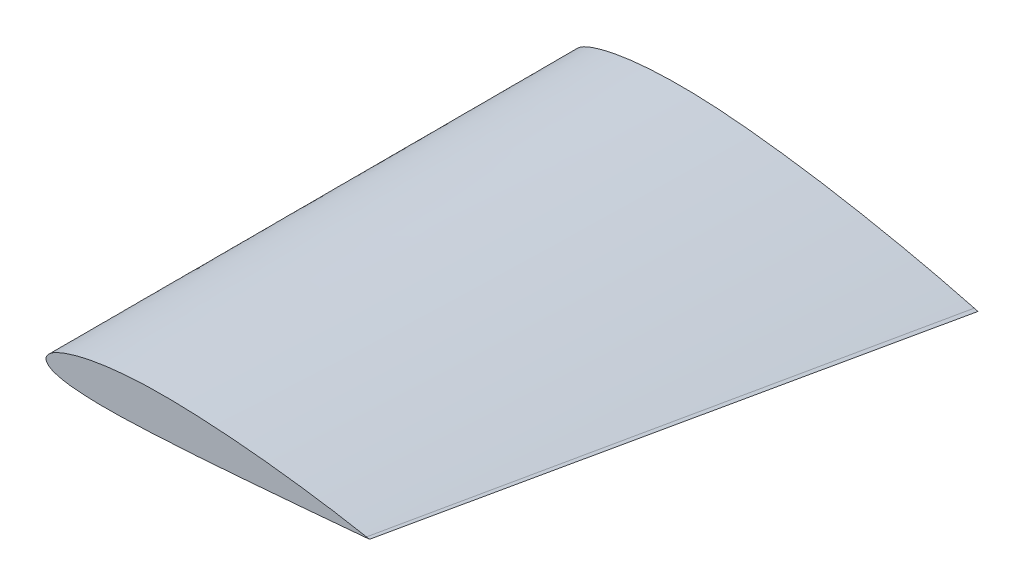
ISO-10303-21;
HEADER;
FILE_DESCRIPTION(('STEP AP214'),'2;1');
FILE_NAME('part.step','',(''),(''),'','','');
FILE_SCHEMA(('AUTOMOTIVE_DESIGN { 1 0 10303 214 1 1 1 1 }'));
ENDSEC;
DATA;
#1=APPLICATION_CONTEXT('core data for automotive mechanical design processes');
#2=APPLICATION_PROTOCOL_DEFINITION('international standard','automotive_design',2000,#1);
#3=PRODUCT_CONTEXT('',#1,'mechanical');
#4=PRODUCT('Part','Part','',(#3));
#5=PRODUCT_RELATED_PRODUCT_CATEGORY('part','',(#4));
#6=PRODUCT_DEFINITION_FORMATION('','',#4);
#7=PRODUCT_DEFINITION_CONTEXT('part definition',#1,'design');
#8=PRODUCT_DEFINITION('design','',#6,#7);
#9=PRODUCT_DEFINITION_SHAPE('','',#8);
#10=(LENGTH_UNIT() NAMED_UNIT(*) SI_UNIT(.MILLI.,.METRE.));
#11=(NAMED_UNIT(*) PLANE_ANGLE_UNIT() SI_UNIT($,.RADIAN.));
#12=(NAMED_UNIT(*) SI_UNIT($,.STERADIAN.) SOLID_ANGLE_UNIT());
#13=UNCERTAINTY_MEASURE_WITH_UNIT(LENGTH_MEASURE(1.E-05),#10,'distance_accuracy_value','');
#14=(GEOMETRIC_REPRESENTATION_CONTEXT(3) GLOBAL_UNCERTAINTY_ASSIGNED_CONTEXT((#13)) GLOBAL_UNIT_ASSIGNED_CONTEXT((#10,
#11,#12)) REPRESENTATION_CONTEXT('',''));
#15=CARTESIAN_POINT('',(0.,0.,0.));
#16=DIRECTION('',(0.,0.,1.));
#17=DIRECTION('',(1.,0.,0.));
#18=AXIS2_PLACEMENT_3D('',#15,#16,#17);
#19=CARTESIAN_POINT('',(25.2194378154388,32.3260001275835,762.));
#20=DIRECTION('',(0.,0.,-1.));
#21=DIRECTION('',(-1.,0.,0.));
#22=AXIS2_PLACEMENT_3D('',#19,#20,#21);
#23=PLANE('',#22);
#24=CARTESIAN_POINT('',(268.796840466726,35.6688979538992,762.));
#25=CARTESIAN_POINT('',(264.720288829095,36.42384319273,762.));
#26=CARTESIAN_POINT('',(256.577892295825,37.9317508661474,762.));
#27=CARTESIAN_POINT('',(240.284487090343,40.6674807716953,762.));
#28=CARTESIAN_POINT('',(219.915007865058,43.6546594969312,762.));
#29=CARTESIAN_POINT('',(195.466083589583,46.6823417151449,762.));
#30=CARTESIAN_POINT('',(171.032194679107,49.1304713415767,762.));
#31=CARTESIAN_POINT('',(146.602549734739,50.7987882256745,762.));
#32=CARTESIAN_POINT('',(122.191533804464,51.7790832284373,762.));
#33=CARTESIAN_POINT('',(101.842925906633,51.6368951043081,762.));
#34=CARTESIAN_POINT('',(85.5965779619275,50.6548527830006,762.));
#35=CARTESIAN_POINT('',(73.4109942150773,49.4366631413632,762.));
#36=CARTESIAN_POINT('',(61.2209387887355,47.64260979663,762.));
#37=CARTESIAN_POINT('',(51.0876277171548,45.5260525553582,762.));
#38=CARTESIAN_POINT('',(43.0213639172621,43.1960430257897,762.));
#39=CARTESIAN_POINT('',(36.9122400554525,41.1009820798503,762.));
#40=CARTESIAN_POINT('',(31.7482460051694,38.6970494096198,762.));
#41=CARTESIAN_POINT('',(27.3091511377606,35.8171597516757,762.));
#42=CARTESIAN_POINT('',(23.4836316371999,30.9099748850938,762.));
#43=CARTESIAN_POINT('',(27.6334209430317,26.7393864897038,762.));
#44=CARTESIAN_POINT('',(32.0784001117748,24.8857129238249,762.));
#45=CARTESIAN_POINT('',(37.2912412060836,23.5125439264132,762.));
#46=CARTESIAN_POINT('',(43.4377659033016,22.5737484441929,762.));
#47=CARTESIAN_POINT('',(51.5949322119316,21.8279166124004,762.));
#48=CARTESIAN_POINT('',(61.7688680642337,21.3278754406256,762.));
#49=CARTESIAN_POINT('',(73.9746097226709,21.2818058683328,762.));
#50=CARTESIAN_POINT('',(86.1656281806745,21.5521795784776,762.));
#51=CARTESIAN_POINT('',(102.412296423288,22.2197741730752,762.));
#52=CARTESIAN_POINT('',(122.718782884065,23.2514268935811,762.));
#53=CARTESIAN_POINT('',(147.07692435792,24.838164982038,762.));
#54=CARTESIAN_POINT('',(171.421597620584,26.7615442253587,762.));
#55=CARTESIAN_POINT('',(195.769310914876,28.7425665906143,762.));
#56=CARTESIAN_POINT('',(220.120839870705,30.7422102052366,762.));
#57=CARTESIAN_POINT('',(240.40453676189,32.5431369772263,762.));
#58=CARTESIAN_POINT('',(256.637275317102,33.9433885459444,762.));
#59=CARTESIAN_POINT('',(264.751495034581,34.6711600343488,762.));
#60=CARTESIAN_POINT('',(268.808883507143,35.0350707676691,762.));
#61=B_SPLINE_CURVE_WITH_KNOTS('',3,(#24,#25,#26,#27,#28,#29,#30,#31,#32,#33,#34,#35,#36,#37,#38,
#39,#40,#41,#42,#43,#44,#45,#46,#47,#48,#49,#50,#51,#52,#53,#54,#55,#56,#57,#58,#59,#60),
.UNSPECIFIED.,.F.,.F.,(4,1,1,1,1,1,1,1,1,1,1,1,1,1,1,1,1,1,1,1,1,1,1,1,1,1,1,1,1,1,1,1,1,1,4),
(0.,0.0250124897498648,0.0499592861642578,0.0996729249269686,0.149206319909966,
0.198581096615965,0.247805170456833,0.296916574601493,0.345952721793533,0.370491625569911,
0.395091203654929,0.41981479582396,0.444798575016595,0.457489818915221,0.47040640543549,
0.483879408669829,0.491264120322896,0.503458853294665,0.513609129403887,0.520450990700287,
0.533235387615153,0.545691039147803,0.558031884237173,0.582609167247894,0.607134741746914,
0.631652079836766,0.656174271859652,0.705233949250519,0.754320378530032,0.803437363555032,
0.852566095729537,0.901700994033254,0.95084880933727,0.975422716989278,1.),.UNSPECIFIED.);
#62=CARTESIAN_POINT('',(268.796840466726,35.6688979538992,762.));
#63=VERTEX_POINT('',#62);
#64=CARTESIAN_POINT('',(268.808883507141,35.0350707676689,762.));
#65=VERTEX_POINT('',#64);
#66=EDGE_CURVE('E668',#63,#65,#61,.T.);
#67=ORIENTED_EDGE('',*,*,#66,.T.);
#68=DIRECTION('',(0.996001879144799,0.0893322827427458,0.));
#69=VECTOR('',#68,1.);
#70=CARTESIAN_POINT('',(268.808883507143,35.0350707676691,762.));
#71=LINE('',#70,#69);
#72=CARTESIAN_POINT('',(271.106577129521,35.2411529253721,762.));
#73=VERTEX_POINT('',#72);
#74=EDGE_CURVE('E678',#65,#73,#71,.T.);
#75=ORIENTED_EDGE('',*,*,#74,.T.);
#76=DIRECTION('',(-0.983280784130301,0.182095852671336,0.));
#77=VECTOR('',#76,1.);
#78=CARTESIAN_POINT('',(271.106577129521,35.2411529253721,762.));
#79=LINE('',#78,#77);
#80=EDGE_CURVE('E484',#73,#63,#79,.T.);
#81=ORIENTED_EDGE('',*,*,#80,.T.);
#82=EDGE_LOOP('',(#67,#75,#81));
#83=FACE_BOUND('',#82,.T.);
#84=ADVANCED_FACE('F461',(#83),#23,.F.);
#85=CARTESIAN_POINT('',(304.402760330862,-9.20630944659419,335.28));
#86=CARTESIAN_POINT('',(268.796840466726,35.6688979538992,762.));
#87=CARTESIAN_POINT('',(301.266510761918,-8.39271064769866,335.28));
#88=CARTESIAN_POINT('',(266.248166645337,36.1408922613008,762.));
#89=CARTESIAN_POINT('',(294.994284138828,-6.76444409501858,335.280000000001));
#90=CARTESIAN_POINT('',(261.150965673747,37.085682579858,762.));
#91=CARTESIAN_POINT('',(285.568661220944,-4.38921575994503,335.28));
#92=CARTESIAN_POINT('',(253.495217184841,38.4485713556741,762.));
#93=CARTESIAN_POINT('',(276.117955357118,-2.1157147127732,335.280000000001));
#94=CARTESIAN_POINT('',(245.825143919969,39.7285367861179,762.));
#95=CARTESIAN_POINT('',(266.648217750481,0.0768159385032686,335.279999999999));
#96=CARTESIAN_POINT('',(238.144494246198,40.9430045244643,762.));
#97=CARTESIAN_POINT('',(257.160348537304,2.18967346189355,335.280000000001));
#98=CARTESIAN_POINT('',(230.453865923155,42.0927994836091,762.));
#99=CARTESIAN_POINT('',(247.656518761221,4.22934208634511,335.28));
#100=CARTESIAN_POINT('',(222.754645788427,43.1833326368151,762.));
#101=CARTESIAN_POINT('',(238.138158778443,6.20013522855942,335.28));
#102=CARTESIAN_POINT('',(215.04771699275,44.2180538076119,762.));
#103=CARTESIAN_POINT('',(228.606164471254,8.10386014301631,335.28));
#104=CARTESIAN_POINT('',(207.333701022426,45.1984928912423,762.));
#105=CARTESIAN_POINT('',(219.060535904495,9.93802983943843,335.28));
#106=CARTESIAN_POINT('',(199.612736668103,46.1226619858701,761.999999999999));
#107=CARTESIAN_POINT('',(209.501882043381,11.7030672087625,335.28));
#108=CARTESIAN_POINT('',(191.885284394497,46.990919415791,762.000000000001));
#109=CARTESIAN_POINT('',(199.92985311861,13.3941380579975,335.28));
#110=CARTESIAN_POINT('',(184.151340549877,47.7994103361665,762.));
#111=CARTESIAN_POINT('',(190.343617483244,15.0028747008962,335.28));
#112=CARTESIAN_POINT('',(176.410711042312,48.541372278302,761.999999999999));
#113=CARTESIAN_POINT('',(180.742470752196,16.5201692299163,335.28));
#114=CARTESIAN_POINT('',(168.66335428455,49.2095654316961,762.));
#115=CARTESIAN_POINT('',(171.126579600997,17.941068761341,335.280000000001));
#116=CARTESIAN_POINT('',(160.909674094045,49.7999449615389,762.));
#117=CARTESIAN_POINT('',(161.497546721608,19.2698647981406,335.279999999999));
#118=CARTESIAN_POINT('',(153.150717839381,50.3161440514188,761.999999999999));
#119=CARTESIAN_POINT('',(151.856741940817,20.510306585202,335.280000000001));
#120=CARTESIAN_POINT('',(145.387355340324,50.7610985045953,762.000000000001));
#121=CARTESIAN_POINT('',(142.205054122065,21.6631790027971,335.279999999999));
#122=CARTESIAN_POINT('',(137.620262465177,51.1356382971318,761.999999999999));
#123=CARTESIAN_POINT('',(132.540979503285,22.7077687846836,335.280000000001));
#124=CARTESIAN_POINT('',(129.849399939509,51.4230279192925,762.000000000001));
#125=CARTESIAN_POINT('',(122.864020673809,23.625900180708,335.28));
#126=CARTESIAN_POINT('',(122.075408000748,51.6087745330922,762.));
#127=CARTESIAN_POINT('',(113.174250358081,24.3982191403113,335.28));
#128=CARTESIAN_POINT('',(114.299428209989,51.6774637539405,762.));
#129=CARTESIAN_POINT('',(105.089337160493,24.9006258286772,335.28));
#130=CARTESIAN_POINT('',(107.819369051546,51.6214278179531,762.));
#131=CARTESIAN_POINT('',(98.6163061153764,25.2057432680527,335.280000000001));
#132=CARTESIAN_POINT('',(102.636711639163,51.4991099979829,762.));
#133=CARTESIAN_POINT('',(93.7593890664864,25.3832476901494,335.279999999999));
#134=CARTESIAN_POINT('',(98.7509218765997,51.3662290319908,762.));
#135=CARTESIAN_POINT('',(88.9007721641182,25.5062344054871,335.28));
#136=CARTESIAN_POINT('',(94.8668437503008,51.1898073995601,761.999999999999));
#137=CARTESIAN_POINT('',(84.0410508960298,25.5727107153145,335.28));
#138=CARTESIAN_POINT('',(90.9850887515657,50.9681841523507,762.000000000001));
#139=CARTESIAN_POINT('',(79.1808762191103,25.5808897251505,335.28));
#140=CARTESIAN_POINT('',(87.1062585985881,50.7000470401854,762.));
#141=CARTESIAN_POINT('',(74.3209630105933,25.5291524352373,335.280000000001));
#142=CARTESIAN_POINT('',(83.2310278091211,50.384090425195,762.));
#143=CARTESIAN_POINT('',(69.4621117739859,25.4147172935621,335.28));
#144=CARTESIAN_POINT('',(79.3601853949637,50.018174463226,762.));
#145=CARTESIAN_POINT('',(64.6052628297273,25.2339003320378,335.280000000001));
#146=CARTESIAN_POINT('',(75.4946938947888,49.5993913886727,762.));
#147=CARTESIAN_POINT('',(59.7514957097872,24.9835066109058,335.28));
#148=CARTESIAN_POINT('',(71.6355928530709,49.1252679682732,762.));
#149=CARTESIAN_POINT('',(54.9020806484466,24.6591411180087,335.280000000001));
#150=CARTESIAN_POINT('',(67.784146173157,48.5923538822817,762.));
#151=CARTESIAN_POINT('',(50.0587506813058,24.2536656616004,335.28));
#152=CARTESIAN_POINT('',(63.9421383686307,47.9950699334941,762.));
#153=CARTESIAN_POINT('',(45.2233445387788,23.7623974286445,335.28));
#154=CARTESIAN_POINT('',(60.111302609857,47.3297635534051,762.));
#155=CARTESIAN_POINT('',(40.3985359966686,23.1754979793704,335.28));
#156=CARTESIAN_POINT('',(56.294330422911,46.5887080363908,761.999999999999));
#157=CARTESIAN_POINT('',(35.5890346152847,22.4732204650149,335.28));
#158=CARTESIAN_POINT('',(52.4960754079543,45.7565723844311,762.000000000001));
#159=CARTESIAN_POINT('',(31.5988198962123,21.7768696073491,335.28));
#160=CARTESIAN_POINT('',(49.3513053025004,44.9752562167625,761.999999999999));
#161=CARTESIAN_POINT('',(28.4209529521505,21.1444657553848,335.28));
#162=CARTESIAN_POINT('',(46.8511132508757,44.2911717924988,762.));
#163=CARTESIAN_POINT('',(26.0450780713698,20.6339376105932,335.28));
#164=CARTESIAN_POINT('',(44.9840809484571,43.7493073074737,762.));
#165=CARTESIAN_POINT('',(23.6772631714486,20.0871952646532,335.28));
#166=CARTESIAN_POINT('',(43.1254601022694,43.179356233858,761.999999999999));
#167=CARTESIAN_POINT('',(21.317876790477,19.5051299766339,335.28));
#168=CARTESIAN_POINT('',(41.27561120829,42.5814323123559,762.000000000001));
#169=CARTESIAN_POINT('',(18.9705130868035,18.8759922318505,335.28));
#170=CARTESIAN_POINT('',(39.4379860092005,41.9467803720737,761.999999999999));
#171=CARTESIAN_POINT('',(16.6395764126751,18.1882936804535,335.280000000001));
#172=CARTESIAN_POINT('',(37.6167983093212,41.2662402476059,762.000000000001));
#173=CARTESIAN_POINT('',(14.3298819819967,17.4319931748299,335.28));
#174=CARTESIAN_POINT('',(35.8164165855504,40.5322102004173,761.999999999999));
#175=CARTESIAN_POINT('',(12.0473799733319,16.5969750597544,335.28));
#176=CARTESIAN_POINT('',(34.0422156045239,39.7368476659676,762.000000000001));
#177=CARTESIAN_POINT('',(10.1742990036811,15.8260381384748,335.28));
#178=CARTESIAN_POINT('',(32.5910509645872,39.0158331325924,761.999999999999));
#179=CARTESIAN_POINT('',(8.69903150423182,15.1563202126041,335.28));
#180=CARTESIAN_POINT('',(31.4516730374498,38.3980020434926,762.000000000001));
#181=CARTESIAN_POINT('',(7.6053373818387,14.6268311530041,335.28));
#182=CARTESIAN_POINT('',(30.6088467269857,37.913659039533,762.));
#183=CARTESIAN_POINT('',(6.52968956438761,14.0612338986911,335.28));
#184=CARTESIAN_POINT('',(29.7824465288261,37.4015359384655,762.));
#185=CARTESIAN_POINT('',(5.48393300410242,13.4416397513991,335.28));
#186=CARTESIAN_POINT('',(28.9829821803084,36.84799221707,762.000000000001));
#187=CARTESIAN_POINT('',(4.47769255546312,12.7594361285564,335.28));
#188=CARTESIAN_POINT('',(28.2185233442194,36.2467579847308,761.999999999999));
#189=CARTESIAN_POINT('',(3.51875431478441,12.0123322436903,335.280000000001));
#190=CARTESIAN_POINT('',(27.4955894963081,35.5963470823094,762.000000000001));
#191=CARTESIAN_POINT('',(2.61299366254586,11.2010081767814,335.279999999999));
#192=CARTESIAN_POINT('',(26.8185481715858,34.8977376659909,761.999999999999));
#193=CARTESIAN_POINT('',(1.77608285003418,10.3188876493248,335.280000000001));
#194=CARTESIAN_POINT('',(26.2006780454618,34.1465155846503,762.000000000001));
#195=CARTESIAN_POINT('',(1.03044983590556,9.35650465229301,335.28));
#196=CARTESIAN_POINT('',(25.659907606413,33.3363987628919,761.999999999999));
#197=CARTESIAN_POINT('',(0.423133789501631,8.30045108671098,335.280000000001));
#198=CARTESIAN_POINT('',(25.2352065633318,32.4593697950635,762.));
#199=CARTESIAN_POINT('',(0.0217638500378362,7.14476908227285,335.28));
#200=CARTESIAN_POINT('',(24.9798063062571,31.5144390157375,762.));
#201=CARTESIAN_POINT('',(-0.0423180522728894,5.91536380697643,335.28));
#202=CARTESIAN_POINT('',(24.9988943855944,30.5298112220318,762.));
#203=CARTESIAN_POINT('',(0.292534743783459,4.73312556912177,335.28));
#204=CARTESIAN_POINT('',(25.3315623761581,29.6052404298255,762.000000000001));
#205=CARTESIAN_POINT('',(0.871580883830201,3.66133307648785,335.28));
#206=CARTESIAN_POINT('',(25.8565164081957,28.7828193496598,762.));
#207=CARTESIAN_POINT('',(1.61207254777365,2.69325320375237,335.279999999999));
#208=CARTESIAN_POINT('',(26.4990049490235,28.0520160762795,762.));
#209=CARTESIAN_POINT('',(2.45894697336678,1.82058097902038,335.28));
#210=CARTESIAN_POINT('',(27.2272722743892,27.4035027955787,762.000000000001));
#211=CARTESIAN_POINT('',(3.38650088626941,1.03324061331168,335.279999999999));
#212=CARTESIAN_POINT('',(28.0095626600406,26.8279516934513,762.));
#213=CARTESIAN_POINT('',(4.38053935064458,0.332864084294066,335.280000000001));
#214=CARTESIAN_POINT('',(28.8436622588094,26.3243780801353,762.));
#215=CARTESIAN_POINT('',(5.42961682674423,-0.282211151342116,335.28));
#216=CARTESIAN_POINT('',(29.7153348011553,25.8941654060508,762.));
#217=CARTESIAN_POINT('',(6.5171886940215,-0.824770513555272,335.28));
#218=CARTESIAN_POINT('',(30.6135958443881,25.5213188039337,762.));
#219=CARTESIAN_POINT('',(7.62691437452345,-1.31998895587748,335.28));
#220=CARTESIAN_POINT('',(31.5274609458175,25.1898434065197,762.));
#221=CARTESIAN_POINT('',(9.12286226665595,-1.94209882491988,335.28));
#222=CARTESIAN_POINT('',(32.7561226931794,24.7773034744354,762.));
#223=CARTESIAN_POINT('',(11.0214024308682,-2.64826605939764,335.28));
#224=CARTESIAN_POINT('',(34.3112290169618,24.3215291615206,762.));
#225=CARTESIAN_POINT('',(13.3331257996457,-3.39869054847372,335.28));
#226=CARTESIAN_POINT('',(36.1982844967324,23.8531247850185,761.999999999999));
#227=CARTESIAN_POINT('',(15.6703346978836,-4.0652940328721,335.28));
#228=CARTESIAN_POINT('',(38.101061355378,23.4533699088629,762.000000000001));
#229=CARTESIAN_POINT('',(18.0269449101949,-4.6591776570408,335.28));
#230=CARTESIAN_POINT('',(40.0151601309086,23.1126075698552,761.999999999999));
#231=CARTESIAN_POINT('',(20.3987735192404,-5.18882726592198,335.28));
#232=CARTESIAN_POINT('',(41.937789444933,22.824011523338,762.000000000001));
#233=CARTESIAN_POINT('',(22.7818612757016,-5.66485331163945,335.28));
#234=CARTESIAN_POINT('',(43.8663654819496,22.5788293610119,761.999999999999));
#235=CARTESIAN_POINT('',(25.1732361878178,-6.09714287808831,335.28));
#236=CARTESIAN_POINT('',(45.7990883462858,22.3690178621763,762.000000000001));
#237=CARTESIAN_POINT('',(27.5708604569773,-6.49310704387245,335.28));
#238=CARTESIAN_POINT('',(47.7347435591449,22.188547950493,761.999999999999));
#239=CARTESIAN_POINT('',(29.9729999039049,-6.86051453714592,335.28));
#240=CARTESIAN_POINT('',(49.6723886510951,22.0311205282115,762.000000000001));
#241=CARTESIAN_POINT('',(33.1800403427349,-7.32212476052597,335.280000000001));
#242=CARTESIAN_POINT('',(52.257659302321,21.8440104831475,761.999999999999));
#243=CARTESIAN_POINT('',(37.1960986387689,-7.84707057713718,335.279999999999));
#244=CARTESIAN_POINT('',(55.4920968678054,21.6520818354811,762.000000000001));
#245=CARTESIAN_POINT('',(42.0248816309391,-8.39916399304555,335.280000000001));
#246=CARTESIAN_POINT('',(59.3766137589853,21.4844217459026,762.));
#247=CARTESIAN_POINT('',(46.8614733688223,-8.87784868811453,335.279999999999));
#248=CARTESIAN_POINT('',(63.2632132455893,21.3757823960895,761.999999999999));
#249=CARTESIAN_POINT('',(51.7041598170427,-9.28998500110441,335.280000000001));
#250=CARTESIAN_POINT('',(67.1509151407105,21.3205920241393,762.));
#251=CARTESIAN_POINT('',(56.5513101368123,-9.64533400917208,335.279999999999));
#252=CARTESIAN_POINT('',(71.0389697765282,21.3109699943284,762.));
#253=CARTESIAN_POINT('',(61.4016615356822,-9.95359758733342,335.280000000001));
#254=CARTESIAN_POINT('',(74.9269177395897,21.3391015735925,761.999999999999));
#255=CARTESIAN_POINT('',(66.2543086657484,-10.2230968004507,335.279999999999));
#256=CARTESIAN_POINT('',(78.8145068697849,21.398298126775,762.000000000001));
#257=CARTESIAN_POINT('',(71.1088188283724,-10.4565778753996,335.280000000001));
#258=CARTESIAN_POINT('',(82.7015470615421,21.4863388104404,761.999999999999));
#259=CARTESIAN_POINT('',(75.9647671181184,-10.6577550817336,335.279999999999));
#260=CARTESIAN_POINT('',(86.5879092036105,21.6002445836469,762.000000000002));
#261=CARTESIAN_POINT('',(80.8218167560277,-10.8301563051515,335.28));
#262=CARTESIAN_POINT('',(90.4735236927823,21.7371695005425,761.999999999998));
#263=CARTESIAN_POINT('',(85.6795997490486,-10.9801849536542,335.28));
#264=CARTESIAN_POINT('',(94.3584591978974,21.8919909815938,762.000000000002));
#265=CARTESIAN_POINT('',(90.5378562309922,-11.1138405300945,335.28));
#266=CARTESIAN_POINT('',(98.2428471684985,22.0599052044135,761.999999999999));
#267=CARTESIAN_POINT('',(95.3963769145079,-11.2374181654123,335.28));
#268=CARTESIAN_POINT('',(102.126876407865,22.2358760776888,762.));
#269=CARTESIAN_POINT('',(100.25514633283,-11.3508501440728,335.28));
#270=CARTESIAN_POINT('',(106.010530757087,22.4199571320374,762.));
#271=CARTESIAN_POINT('',(105.114145875396,-11.4539250329825,335.28));
#272=CARTESIAN_POINT('',(109.893783362913,22.6123164293117,762.000000000001));
#273=CARTESIAN_POINT('',(111.593094420169,-11.5773678182527,335.28));
#274=CARTESIAN_POINT('',(115.070888332859,22.8799745199883,761.999999999999));
#275=CARTESIAN_POINT('',(119.692259907737,-11.7049476261095,335.28));
#276=CARTESIAN_POINT('',(121.541141915697,23.2359019751475,762.));
#277=CARTESIAN_POINT('',(129.411855298117,-11.8140095086016,335.28));
#278=CARTESIAN_POINT('',(129.30343421653,23.6981821463445,762.000000000001));
#279=CARTESIAN_POINT('',(139.131841818301,-11.878944487633,335.28));
#280=CARTESIAN_POINT('',(137.06354412068,24.1957056605783,761.999999999998));
#281=CARTESIAN_POINT('',(148.852023310188,-11.9010026024301,335.28));
#282=CARTESIAN_POINT('',(144.821387450652,24.7274411099186,762.000000000002));
#283=CARTESIAN_POINT('',(158.572200322179,-11.8792116219705,335.279999999999));
#284=CARTESIAN_POINT('',(152.576747231685,25.2941915294183,762.));
#285=CARTESIAN_POINT('',(168.292225479559,-11.8222635425676,335.280000000001));
#286=CARTESIAN_POINT('',(160.330000086457,25.8889700945775,762.));
#287=CARTESIAN_POINT('',(178.012076378362,-11.7418628655629,335.279999999999));
#288=CARTESIAN_POINT('',(168.081789265588,26.50244580879,762.));
#289=CARTESIAN_POINT('',(187.731823667176,-11.6500361847264,335.280000000001));
#290=CARTESIAN_POINT('',(175.832848596507,27.1250509166751,762.));
#291=CARTESIAN_POINT('',(197.451518686121,-11.5528741042435,335.279999999999));
#292=CARTESIAN_POINT('',(183.583565492626,27.7519005556739,761.999999999999));
#293=CARTESIAN_POINT('',(207.17115714329,-11.4502173661941,335.280000000001));
#294=CARTESIAN_POINT('',(191.333926276442,28.3831371473227,762.000000000001));
#295=CARTESIAN_POINT('',(216.890770926729,-11.3452589037019,335.28));
#296=CARTESIAN_POINT('',(199.084137523265,29.016206183425,761.999999999999));
#297=CARTESIAN_POINT('',(226.610336029425,-11.2358677442312,335.28));
#298=CARTESIAN_POINT('',(206.834059277657,29.652811211352,762.000000000001));
#299=CARTESIAN_POINT('',(236.329780670761,-11.1160596588711,335.28));
#300=CARTESIAN_POINT('',(214.583296252887,30.2977212843677,761.999999999999));
#301=CARTESIAN_POINT('',(246.049002245184,-10.9792045896823,335.28));
#302=CARTESIAN_POINT('',(222.331391739665,30.956222446865,762.000000000001));
#303=CARTESIAN_POINT('',(255.767933980724,-10.8231921843609,335.28));
#304=CARTESIAN_POINT('',(230.078173306585,31.6299943405362,761.999999999999));
#305=CARTESIAN_POINT('',(265.486741528335,-10.6599085349233,335.28));
#306=CARTESIAN_POINT('',(237.824444729866,32.3095616956013,762.));
#307=CARTESIAN_POINT('',(275.205580814802,-10.4983657997457,335.280000000001));
#308=CARTESIAN_POINT('',(245.570840049061,32.987741557904,761.999999999999));
#309=CARTESIAN_POINT('',(284.924592033544,-10.3475407097028,335.279999999999));
#310=CARTESIAN_POINT('',(253.317977959037,33.657378586861,762.));
#311=CARTESIAN_POINT('',(294.64334070486,-10.1803595623008,335.280000000001));
#312=CARTESIAN_POINT('',(261.063982596015,34.3400527695119,761.999999999999));
#313=CARTESIAN_POINT('',(301.122310964272,-10.0584255967155,335.28));
#314=CARTESIAN_POINT('',(266.227236477729,34.8035205796598,762.));
#315=CARTESIAN_POINT('',(304.602069363251,-9.99318482927907,335.28));
#316=CARTESIAN_POINT('',(269.000357975675,35.052244280811,762.));
#317=CARTESIAN_POINT('',(305.082599978701,-9.98417552962831,335.28));
#318=CARTESIAN_POINT('',(269.383306912738,35.0865913070949,761.999999999998));
#319=CARTESIAN_POINT('',(305.803395901876,-9.97066158015216,335.280000000001));
#320=CARTESIAN_POINT('',(269.957730318332,35.1381118465206,762.000000000002));
#321=CARTESIAN_POINT('',(306.52419182505,-9.95714763067604,335.28));
#322=CARTESIAN_POINT('',(270.532153723926,35.1896323859464,761.999999999999));
#323=CARTESIAN_POINT('',(307.0047224405,-9.94813833102527,335.28));
#324=CARTESIAN_POINT('',(270.915102660989,35.2239794122302,762.));
#325=CARTESIAN_POINT('',(307.244987748225,-9.94363368119989,335.28));
#326=CARTESIAN_POINT('',(271.106577129521,35.2411529253721,762.));
#327=B_SPLINE_SURFACE_WITH_KNOTS('',3,1,((#85,#86),(#87,#88),(#89,#90),(#91,#92),(#93,#94),(#95,
#96),(#97,#98),(#99,#100),(#101,#102),(#103,#104),(#105,#106),(#107,#108),(#109,#110),(#111,
#112),(#113,#114),(#115,#116),(#117,#118),(#119,#120),(#121,#122),(#123,#124),(#125,#126),(#127,
#128),(#129,#130),(#131,#132),(#133,#134),(#135,#136),(#137,#138),(#139,#140),(#141,#142),(#143,
#144),(#145,#146),(#147,#148),(#149,#150),(#151,#152),(#153,#154),(#155,#156),(#157,#158),(#159,
#160),(#161,#162),(#163,#164),(#165,#166),(#167,#168),(#169,#170),(#171,#172),(#173,#174),(#175,
#176),(#177,#178),(#179,#180),(#181,#182),(#183,#184),(#185,#186),(#187,#188),(#189,#190),(#191,
#192),(#193,#194),(#195,#196),(#197,#198),(#199,#200),(#201,#202),(#203,#204),(#205,#206),(#207,
#208),(#209,#210),(#211,#212),(#213,#214),(#215,#216),(#217,#218),(#219,#220),(#221,#222),(#223,
#224),(#225,#226),(#227,#228),(#229,#230),(#231,#232),(#233,#234),(#235,#236),(#237,#238),(#239,
#240),(#241,#242),(#243,#244),(#245,#246),(#247,#248),(#249,#250),(#251,#252),(#253,#254),(#255,
#256),(#257,#258),(#259,#260),(#261,#262),(#263,#264),(#265,#266),(#267,#268),(#269,#270),(#271,
#272),(#273,#274),(#275,#276),(#277,#278),(#279,#280),(#281,#282),(#283,#284),(#285,#286),(#287,
#288),(#289,#290),(#291,#292),(#293,#294),(#295,#296),(#297,#298),(#299,#300),(#301,#302),(#303,
#304),(#305,#306),(#307,#308),(#309,#310),(#311,#312),(#313,#314),(#315,#316),(#317,#318),(#319,
#320),(#321,#322),(#323,#324),(#325,#326)),.UNSPECIFIED.,.F.,.F.,.F.,(4,1,1,1,1,1,1,1,1,1,1,1,1,
1,1,1,1,1,1,1,1,1,1,1,1,1,1,1,1,1,1,1,1,1,1,1,1,1,1,1,1,1,1,1,1,1,1,1,1,1,1,1,1,1,1,1,1,1,1,1,1,
1,1,1,1,1,1,1,1,1,1,1,1,1,1,1,1,1,1,1,1,1,1,1,1,1,1,1,1,1,1,1,1,1,1,1,1,1,1,1,1,1,1,1,1,1,1,1,1,
1,1,1,1,2,1,1,1,4),(2,2),(0.,0.0155529052140533,0.0311058104281065,0.0466587156421598,
0.0622116208562131,0.0777645260702663,0.0933174312843196,0.108870336498373,0.124423241712426,
0.139976146926479,0.155529052140533,0.171081957354586,0.186634862568639,0.202187767782693,
0.217740672996746,0.233293578210799,0.248846483424852,0.264399388638906,0.279952293852959,
0.295505199067012,0.311058104281065,0.326611009495119,0.334387462102145,0.342163914709172,
0.349940367316199,0.357716819923225,0.365493272530252,0.373269725137279,0.381046177744305,
0.388822630351332,0.396599082958358,0.404375535565385,0.412151988172412,0.419928440779438,
0.427704893386465,0.435481345993492,0.443257798600518,0.447146024904032,0.451034251207545,
0.454922477511058,0.458810703814572,0.462698930118085,0.466587156421598,0.470475382725112,
0.474363609028625,0.478251835332138,0.480195948483895,0.482140061635652,0.484084174787408,
0.486028287939165,0.487972401090922,0.489916514242678,0.491860627394435,0.493804740546192,
0.495748853697948,0.497692966849705,0.499637080001461,0.501581193153218,0.503525306304975,
0.505469419456731,0.507413532608488,0.509357645760245,0.511301758912001,0.513245872063758,
0.515189985215515,0.517134098367271,0.519078211519028,0.521022324670785,0.524910550974298,
0.528798777277811,0.532687003581324,0.536575229884838,0.540463456188351,0.544351682491865,
0.548239908795378,0.552128135098891,0.556016361402405,0.559904587705918,0.567681040312945,
0.575457492919971,0.583233945526998,0.591010398134024,0.598786850741051,0.606563303348078,
0.614339755955104,0.622116208562131,0.629892661169158,0.637669113776184,0.645445566383211,
0.653222018990238,0.660998471597264,0.668774924204291,0.676551376811318,0.684327829418344,
0.699880734632398,0.715433639846451,0.730986545060504,0.746539450274557,0.76209235548861,
0.777645260702663,0.793198165916717,0.80875107113077,0.824303976344824,0.839856881558877,
0.85540978677293,0.870962691986983,0.886515597201037,0.90206850241509,0.917621407629143,
0.933174312843196,0.94872721805725,0.964280123271303,0.979833028485356,0.995385933699409,
0.996539450274557,0.997692966849705,0.998846483424852,1.),(0.,1.),.UNSPECIFIED.);
#328=CARTESIAN_POINT('',(304.402760330862,-9.20630944659419,335.28));
#329=CARTESIAN_POINT('',(299.386393305391,-7.90497481201767,335.28));
#330=CARTESIAN_POINT('',(289.366834347577,-5.30572339584777,335.28));
#331=CARTESIAN_POINT('',(269.292243904673,-0.455697423157408,335.28));
#332=CARTESIAN_POINT('',(244.157418672505,5.06781338310643,335.28));
#333=CARTESIAN_POINT('',(213.939526940218,11.0020798515505,335.28));
#334=CARTESIAN_POINT('',(183.689202989143,16.2123768076077,335.28));
#335=CARTESIAN_POINT('',(153.375306279358,20.4499536681621,335.28));
#336=CARTESIAN_POINT('',(123.023879434396,23.8279937515789,335.28));
#337=CARTESIAN_POINT('',(97.6387270802609,25.4476667217114,335.28));
#338=CARTESIAN_POINT('',(77.2944991132529,25.6578621472548,335.28));
#339=CARTESIAN_POINT('',(61.9927674424906,25.2150041123373,335.28));
#340=CARTESIAN_POINT('',(46.6346060614054,24.0544988743007,335.28));
#341=CARTESIAN_POINT('',(33.8125107720127,22.3102356550694,335.28));
#342=CARTESIAN_POINT('',(23.5489584859863,20.1172806172784,335.28));
#343=CARTESIAN_POINT('',(15.746504065811,18.0444487868224,335.28));
#344=CARTESIAN_POINT('',(9.09525196040015,15.5030225280142,335.28));
#345=CARTESIAN_POINT('',(3.3058423556047,12.3041122734786,335.28));
#346=CARTESIAN_POINT('',(-1.89753120359885,6.52319165220481,335.28));
#347=CARTESIAN_POINT('',(2.9085232795749,0.956438003309505,335.28));
#348=CARTESIAN_POINT('',(8.28725340148274,-1.74743197735782,335.28));
#349=CARTESIAN_POINT('',(14.6658603281018,-3.91997195654178,335.28));
#350=CARTESIAN_POINT('',(22.2470326391204,-5.63334611474105,335.28));
#351=CARTESIAN_POINT('',(32.3523061827,-7.28367259020146,335.28));
#352=CARTESIAN_POINT('',(44.99398695688,-8.805622753048,335.28));
#353=CARTESIAN_POINT('',(60.2092078821352,-9.94094448088815,335.28));
#354=CARTESIAN_POINT('',(75.4340153229212,-10.6803941835911,335.28));
#355=CARTESIAN_POINT('',(95.7508740799061,-11.2827014769947,335.28));
#356=CARTESIAN_POINT('',(121.162053183256,-11.7895849794283,335.28));
#357=CARTESIAN_POINT('',(151.674243405201,-11.9621327200227,335.28));
#358=CARTESIAN_POINT('',(182.199368639073,-11.7137346180102,335.28));
#359=CARTESIAN_POINT('',(212.733374886763,-11.3937300057121,335.28));
#360=CARTESIAN_POINT('',(243.273783292522,-11.0508435913844,335.28));
#361=CARTESIAN_POINT('',(268.724480055498,-10.5965099036701,335.28));
#362=CARTESIAN_POINT('',(289.088670202664,-10.2840400987377,335.28));
#363=CARTESIAN_POINT('',(299.270526365105,-10.0931440554488,335.28));
#364=CARTESIAN_POINT('',(304.361804055526,-9.99768947910446,335.28));
#365=B_SPLINE_CURVE_WITH_KNOTS('',3,(#328,#329,#330,#331,#332,#333,#334,#335,#336,#337,#338,
#339,#340,#341,#342,#343,#344,#345,#346,#347,#348,#349,#350,#351,#352,#353,#354,#355,#356,#357,
#358,#359,#360,#361,#362,#363,#364),.UNSPECIFIED.,.F.,.F.,(4,1,1,1,1,1,1,1,1,1,1,1,1,1,1,1,1,1,
1,1,1,1,1,1,1,1,1,1,1,1,1,1,1,1,4),(0.,0.0250124897498648,0.0499592861642578,0.0996729249269686,
0.149206319909966,0.198581096615965,0.247805170456833,0.296916574601493,0.345952721793533,
0.370491625569911,0.395091203654929,0.41981479582396,0.444798575016595,0.457489818915221,
0.47040640543549,0.483879408669829,0.491264120322896,0.503458853294665,0.513609129403887,
0.520450990700287,0.533235387615153,0.545691039147803,0.558031884237173,0.582609167247894,
0.607134741746914,0.631652079836766,0.656174271859652,0.705233949250519,0.754320378530032,
0.803437363555032,0.852566095729537,0.901700994033254,0.95084880933727,0.975422716989278,1.),.UNSPECIFIED.);
#366=CARTESIAN_POINT('',(304.402760330862,-9.20630944659418,335.28));
#367=VERTEX_POINT('',#366);
#368=CARTESIAN_POINT('',(49.0219891897218,-9.05897370885619,335.28));
#369=VERTEX_POINT('',#368);
#370=EDGE_CURVE('E619',#367,#369,#365,.T.);
#371=CARTESIAN_POINT('',(179.841619958646,-11.723553664972,335.28));
#372=VERTEX_POINT('',#371);
#373=EDGE_CURVE('E719',#369,#372,#365,.T.);
#374=CARTESIAN_POINT('',(304.361804055524,-9.99768947910449,335.28));
#375=VERTEX_POINT('',#374);
#376=EDGE_CURVE('E573',#372,#375,#365,.T.);
#377=DIRECTION('',(0.999824290409473,0.0187453542829436,0.));
#378=VECTOR('',#377,1.);
#379=CARTESIAN_POINT('',(304.361804055526,-9.99768947910445,335.28));
#380=LINE('',#379,#378);
#381=CARTESIAN_POINT('',(307.244987748225,-9.94363368119989,335.28));
#382=VERTEX_POINT('',#381);
#383=EDGE_CURVE('E711',#375,#382,#380,.T.);
#384=DIRECTION('',(-0.0839209013685051,0.104928466837567,0.99093254016639));
#385=VECTOR('',#384,1.);
#386=CARTESIAN_POINT('',(289.175782438873,12.6487596220861,548.64));
#387=LINE('',#386,#385);
#388=EDGE_CURVE('E638',#382,#73,#387,.T.);
#389=DIRECTION('',(0.0826990840866581,-0.104228132972843,-0.99110915533468));
#390=VECTOR('',#389,1.);
#391=CARTESIAN_POINT('',(286.599800398794,13.2312942536525,548.64));
#392=LINE('',#391,#390);
#393=EDGE_CURVE('E569',#63,#367,#392,.T.);
#394=ORIENTED_EDGE('',*,*,#370,.T.);
#395=ORIENTED_EDGE('',*,*,#373,.T.);
#396=ORIENTED_EDGE('',*,*,#376,.T.);
#397=ORIENTED_EDGE('',*,*,#383,.T.);
#398=ORIENTED_EDGE('',*,*,#388,.T.);
#399=ORIENTED_EDGE('',*,*,#74,.F.);
#400=ORIENTED_EDGE('',*,*,#66,.F.);
#401=ORIENTED_EDGE('',*,*,#393,.T.);
#402=EDGE_LOOP('',(#394,#395,#396,#397,#398,#399,#400,#401));
#403=FACE_BOUND('',#402,.T.);
#404=ADVANCED_FACE('F593',(#403),#327,.T.);
#405=CARTESIAN_POINT('',(307.244987748225,-9.94363368119989,335.28));
#406=CARTESIAN_POINT('',(271.106577129521,35.2411529253721,762.));
#407=CARTESIAN_POINT('',(304.402760330862,-9.20630944659418,335.28));
#408=CARTESIAN_POINT('',(268.796840466726,35.6688979538992,762.));
#409=B_SPLINE_SURFACE_WITH_KNOTS('',1,1,((#405,#406),(#407,#408)),.UNSPECIFIED.,.F.,.F.,.F.,(2,
2),(2,2),(0.,1.),(0.,1.),.UNSPECIFIED.);
#410=DIRECTION('',(-0.967959619448524,0.251105904186,0.));
#411=VECTOR('',#410,1.);
#412=CARTESIAN_POINT('',(307.244987748225,-9.94363368119989,335.28));
#413=LINE('',#412,#411);
#414=EDGE_CURVE('E634',#382,#367,#413,.T.);
#415=ORIENTED_EDGE('',*,*,#414,.T.);
#416=ORIENTED_EDGE('',*,*,#393,.F.);
#417=ORIENTED_EDGE('',*,*,#80,.F.);
#418=ORIENTED_EDGE('',*,*,#388,.F.);
#419=EDGE_LOOP('',(#415,#416,#417,#418));
#420=FACE_BOUND('',#419,.T.);
#421=ADVANCED_FACE('F590',(#420),#409,.T.);
#422=CARTESIAN_POINT('',(307.255479673751,-49.0589737088562,335.28));
#423=DIRECTION('',(0.,0.,-1.));
#424=DIRECTION('',(-1.,0.,0.));
#425=AXIS2_PLACEMENT_3D('',#422,#423,#424);
#426=PLANE('',#425);
#427=DIRECTION('',(1.,0.,0.));
#428=VECTOR('',#427,1.);
#429=CARTESIAN_POINT('',(27.7464956937499,-4.56519793058207,335.28));
#430=LINE('',#429,#428);
#431=CARTESIAN_POINT('',(27.7464956937499,-4.56519793058207,335.28));
#432=VERTEX_POINT('',#431);
#433=CARTESIAN_POINT('',(147.74649569375,-4.56519793058207,335.28));
#434=VERTEX_POINT('',#433);
#435=EDGE_CURVE('E558',#432,#434,#430,.T.);
#436=ORIENTED_EDGE('',*,*,#435,.T.);
#437=DIRECTION('',(0.,-1.,0.));
#438=VECTOR('',#437,1.);
#439=CARTESIAN_POINT('',(147.74649569375,-49.0589737088562,335.28));
#440=LINE('',#439,#438);
#441=CARTESIAN_POINT('',(147.74649569375,17.4885238272037,335.28));
#442=VERTEX_POINT('',#441);
#443=EDGE_CURVE('E470',#442,#434,#440,.T.);
#444=ORIENTED_EDGE('',*,*,#443,.F.);
#445=DIRECTION('',(-1.,0.,0.));
#446=VECTOR('',#445,1.);
#447=CARTESIAN_POINT('',(307.255479673751,17.4885238272037,335.28));
#448=LINE('',#447,#446);
#449=CARTESIAN_POINT('',(27.7464956937499,17.4885238272037,335.28));
#450=VERTEX_POINT('',#449);
#451=EDGE_CURVE('E733',#442,#450,#448,.T.);
#452=ORIENTED_EDGE('',*,*,#451,.T.);
#453=DIRECTION('',(0.,1.,0.));
#454=VECTOR('',#453,1.);
#455=CARTESIAN_POINT('',(27.7464956937499,-49.0589737088562,335.28));
#456=LINE('',#455,#454);
#457=EDGE_CURVE('E12',#432,#450,#456,.T.);
#458=ORIENTED_EDGE('',*,*,#457,.F.);
#459=EDGE_LOOP('',(#436,#444,#452,#458));
#460=FACE_BOUND('',#459,.T.);
#461=ORIENTED_EDGE('',*,*,#414,.F.);
#462=ORIENTED_EDGE('',*,*,#383,.F.);
#463=ORIENTED_EDGE('',*,*,#376,.F.);
#464=ORIENTED_EDGE('',*,*,#373,.F.);
#465=ORIENTED_EDGE('',*,*,#370,.F.);
#466=EDGE_LOOP('',(#461,#462,#463,#464,#465));
#467=FACE_BOUND('',#466,.T.);
#468=ADVANCED_FACE('F580',(#460,#467),#426,.T.);
#469=CARTESIAN_POINT('',(27.7464956937499,17.3446837116333,333.222990512901));
#470=DIRECTION('',(-1.,0.,0.));
#471=DIRECTION('',(0.,-1.,0.));
#472=AXIS2_PLACEMENT_3D('',#469,#470,#471);
#473=PLANE('',#472);
#474=ORIENTED_EDGE('',*,*,#457,.T.);
#475=DIRECTION('',(0.,-0.0697564737441257,-0.997564050259824));
#476=VECTOR('',#475,1.);
#477=CARTESIAN_POINT('',(27.7464956937499,18.7163053559021,352.838093878072));
#478=LINE('',#477,#476);
#479=CARTESIAN_POINT('',(27.7464956937499,18.7163053559021,352.838093878072));
#480=VERTEX_POINT('',#479);
#481=EDGE_CURVE('E477',#480,#450,#478,.T.);
#482=ORIENTED_EDGE('',*,*,#481,.F.);
#483=DIRECTION('',(0.,-0.997564050259824,0.0697564737441264));
#484=VECTOR('',#483,1.);
#485=CARTESIAN_POINT('',(27.7464956937499,18.7163053559021,352.838093878072));
#486=LINE('',#485,#484);
#487=CARTESIAN_POINT('',(27.7464956937499,-3.23010374981399,354.372736300442));
#488=VERTEX_POINT('',#487);
#489=EDGE_CURVE('E537',#480,#488,#486,.T.);
#490=ORIENTED_EDGE('',*,*,#489,.T.);
#491=DIRECTION('',(0.,0.0697564737441257,0.997564050259824));
#492=VECTOR('',#491,1.);
#493=CARTESIAN_POINT('',(27.7464956937499,-4.60172539408282,334.757632935272));
#494=LINE('',#493,#492);
#495=EDGE_CURVE('E563',#432,#488,#494,.T.);
#496=ORIENTED_EDGE('',*,*,#495,.F.);
#497=EDGE_LOOP('',(#474,#482,#490,#496));
#498=FACE_BOUND('',#497,.T.);
#499=ADVANCED_FACE('F541',(#498),#473,.F.);
#500=CARTESIAN_POINT('',(147.74649569375,-4.60172539408282,334.757632935272));
#501=DIRECTION('',(1.,0.,0.));
#502=DIRECTION('',(0.,0.,-1.));
#503=AXIS2_PLACEMENT_3D('',#500,#501,#502);
#504=PLANE('',#503);
#505=ORIENTED_EDGE('',*,*,#443,.T.);
#506=DIRECTION('',(0.,0.0697564737441257,0.997564050259824));
#507=VECTOR('',#506,1.);
#508=CARTESIAN_POINT('',(147.74649569375,-4.60172539408282,334.757632935272));
#509=LINE('',#508,#507);
#510=CARTESIAN_POINT('',(147.74649569375,-3.23010374981399,354.372736300442));
#511=VERTEX_POINT('',#510);
#512=EDGE_CURVE('E566',#434,#511,#509,.T.);
#513=ORIENTED_EDGE('',*,*,#512,.T.);
#514=DIRECTION('',(0.,0.997564050259824,-0.0697564737441264));
#515=VECTOR('',#514,1.);
#516=CARTESIAN_POINT('',(147.74649569375,-3.23010374981399,354.372736300442));
#517=LINE('',#516,#515);
#518=CARTESIAN_POINT('',(147.74649569375,18.7163053559021,352.838093878072));
#519=VERTEX_POINT('',#518);
#520=EDGE_CURVE('E536',#511,#519,#517,.T.);
#521=ORIENTED_EDGE('',*,*,#520,.T.);
#522=DIRECTION('',(0.,-0.0697564737441257,-0.997564050259824));
#523=VECTOR('',#522,1.);
#524=CARTESIAN_POINT('',(147.74649569375,18.7163053559021,352.838093878072));
#525=LINE('',#524,#523);
#526=EDGE_CURVE('E531',#519,#442,#525,.T.);
#527=ORIENTED_EDGE('',*,*,#526,.T.);
#528=EDGE_LOOP('',(#505,#513,#521,#527));
#529=FACE_BOUND('',#528,.T.);
#530=ADVANCED_FACE('F739',(#529),#504,.F.);
#531=CARTESIAN_POINT('',(27.7464956937499,-4.60172539408282,334.757632935272));
#532=DIRECTION('',(0.,-0.997564050259824,0.0697564737441257));
#533=DIRECTION('',(0.,-0.0697564737441257,-0.997564050259824));
#534=AXIS2_PLACEMENT_3D('',#531,#532,#533);
#535=PLANE('',#534);
#536=ORIENTED_EDGE('',*,*,#495,.T.);
#537=DIRECTION('',(1.,0.,0.));
#538=VECTOR('',#537,1.);
#539=CARTESIAN_POINT('',(27.7464956937499,-3.23010374981399,354.372736300442));
#540=LINE('',#539,#538);
#541=EDGE_CURVE('E545',#488,#511,#540,.T.);
#542=ORIENTED_EDGE('',*,*,#541,.T.);
#543=ORIENTED_EDGE('',*,*,#512,.F.);
#544=ORIENTED_EDGE('',*,*,#435,.F.);
#545=EDGE_LOOP('',(#536,#542,#543,#544));
#546=FACE_BOUND('',#545,.T.);
#547=ADVANCED_FACE('F742',(#546),#535,.F.);
#548=CARTESIAN_POINT('',(27.7464956937499,18.7163053559021,352.838093878072));
#549=DIRECTION('',(0.,-0.997564050259824,0.0697564737441257));
#550=DIRECTION('',(0.,-0.0697564737441257,-0.997564050259824));
#551=AXIS2_PLACEMENT_3D('',#548,#549,#550);
#552=PLANE('',#551);
#553=ORIENTED_EDGE('',*,*,#526,.F.);
#554=DIRECTION('',(-1.,0.,0.));
#555=VECTOR('',#554,1.);
#556=CARTESIAN_POINT('',(27.7464956937499,18.7163053559021,352.838093878072));
#557=LINE('',#556,#555);
#558=EDGE_CURVE('E528',#519,#480,#557,.T.);
#559=ORIENTED_EDGE('',*,*,#558,.T.);
#560=ORIENTED_EDGE('',*,*,#481,.T.);
#561=ORIENTED_EDGE('',*,*,#451,.F.);
#562=EDGE_LOOP('',(#553,#559,#560,#561));
#563=FACE_BOUND('',#562,.T.);
#564=ADVANCED_FACE('F529',(#563),#552,.T.);
#565=CARTESIAN_POINT('',(0.,24.643858729493,352.423598968032));
#566=DIRECTION('',(0.,-0.0697564737441264,-0.997564050259824));
#567=DIRECTION('',(0.,-0.997564050259824,0.0697564737441264));
#568=AXIS2_PLACEMENT_3D('',#565,#566,#567);
#569=PLANE('',#568);
#570=ORIENTED_EDGE('',*,*,#489,.F.);
#571=ORIENTED_EDGE('',*,*,#558,.F.);
#572=ORIENTED_EDGE('',*,*,#520,.F.);
#573=ORIENTED_EDGE('',*,*,#541,.F.);
#574=EDGE_LOOP('',(#570,#571,#572,#573));
#575=FACE_BOUND('',#574,.T.);
#576=ADVANCED_FACE('F548',(#575),#569,.T.);
#577=CLOSED_SHELL('',(#84,#404,#421,#468,#499,#530,#547,#564,#576));
#578=MANIFOLD_SOLID_BREP('B2',#577);
#579=ADVANCED_BREP_SHAPE_REPRESENTATION('',(#18,#578),#14);
#580=SHAPE_DEFINITION_REPRESENTATION(#9,#579);
ENDSEC;
END-ISO-10303-21;
